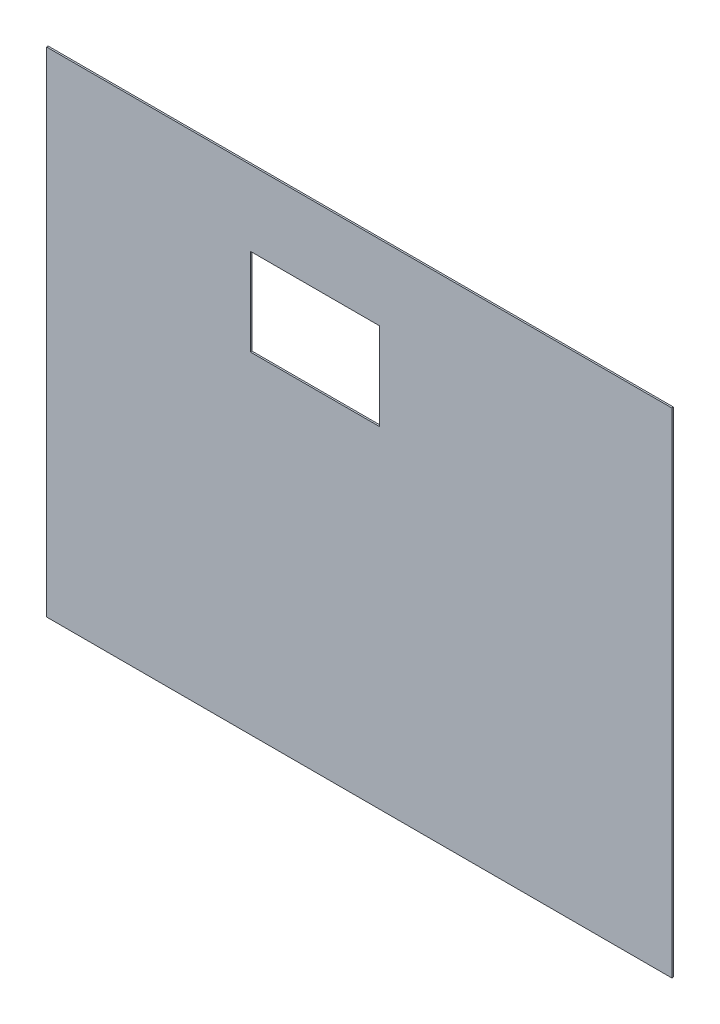
ISO-10303-21;
HEADER;
FILE_DESCRIPTION(('STEP AP214'),'2;1');
FILE_NAME('part.step','',(''),(''),'','','');
FILE_SCHEMA(('AUTOMOTIVE_DESIGN { 1 0 10303 214 1 1 1 1 }'));
ENDSEC;
DATA;
#1=APPLICATION_CONTEXT('core data for automotive mechanical design processes');
#2=APPLICATION_PROTOCOL_DEFINITION('international standard','automotive_design',2000,#1);
#3=PRODUCT_CONTEXT('',#1,'mechanical');
#4=PRODUCT('Part','Part','',(#3));
#5=PRODUCT_RELATED_PRODUCT_CATEGORY('part','',(#4));
#6=PRODUCT_DEFINITION_FORMATION('','',#4);
#7=PRODUCT_DEFINITION_CONTEXT('part definition',#1,'design');
#8=PRODUCT_DEFINITION('design','',#6,#7);
#9=PRODUCT_DEFINITION_SHAPE('','',#8);
#10=(LENGTH_UNIT() NAMED_UNIT(*) SI_UNIT(.MILLI.,.METRE.));
#11=(NAMED_UNIT(*) PLANE_ANGLE_UNIT() SI_UNIT($,.RADIAN.));
#12=(NAMED_UNIT(*) SI_UNIT($,.STERADIAN.) SOLID_ANGLE_UNIT());
#13=UNCERTAINTY_MEASURE_WITH_UNIT(LENGTH_MEASURE(1.E-05),#10,'distance_accuracy_value','');
#14=(GEOMETRIC_REPRESENTATION_CONTEXT(3) GLOBAL_UNCERTAINTY_ASSIGNED_CONTEXT((#13)) GLOBAL_UNIT_ASSIGNED_CONTEXT((#10,
#11,#12)) REPRESENTATION_CONTEXT('',''));
#15=CARTESIAN_POINT('',(0.,0.,0.));
#16=DIRECTION('',(0.,0.,1.));
#17=DIRECTION('',(1.,0.,0.));
#18=AXIS2_PLACEMENT_3D('',#15,#16,#17);
#19=CARTESIAN_POINT('',(-190.,-150.,1.));
#20=DIRECTION('',(1.,0.,0.));
#21=DIRECTION('',(0.,0.,-1.));
#22=AXIS2_PLACEMENT_3D('',#19,#20,#21);
#23=PLANE('',#22);
#24=DIRECTION('',(0.,-1.,0.));
#25=VECTOR('',#24,1.);
#26=CARTESIAN_POINT('',(-190.,-150.,0.));
#27=LINE('',#26,#25);
#28=CARTESIAN_POINT('',(-190.,150.,0.));
#29=VERTEX_POINT('',#28);
#30=CARTESIAN_POINT('',(-190.,-150.,0.));
#31=VERTEX_POINT('',#30);
#32=EDGE_CURVE('E132',#29,#31,#27,.T.);
#33=ORIENTED_EDGE('',*,*,#32,.T.);
#34=DIRECTION('',(0.,0.,-1.));
#35=VECTOR('',#34,1.);
#36=CARTESIAN_POINT('',(-190.,-150.,1.));
#37=LINE('',#36,#35);
#38=CARTESIAN_POINT('',(-190.,-150.,1.));
#39=VERTEX_POINT('',#38);
#40=EDGE_CURVE('E11',#39,#31,#37,.T.);
#41=ORIENTED_EDGE('',*,*,#40,.F.);
#42=DIRECTION('',(0.,-1.,0.));
#43=VECTOR('',#42,1.);
#44=CARTESIAN_POINT('',(-190.,-150.,1.));
#45=LINE('',#44,#43);
#46=CARTESIAN_POINT('',(-190.,150.,1.));
#47=VERTEX_POINT('',#46);
#48=EDGE_CURVE('E136',#47,#39,#45,.T.);
#49=ORIENTED_EDGE('',*,*,#48,.F.);
#50=DIRECTION('',(0.,0.,-1.));
#51=VECTOR('',#50,1.);
#52=CARTESIAN_POINT('',(-190.,150.,1.));
#53=LINE('',#52,#51);
#54=EDGE_CURVE('E146',#47,#29,#53,.T.);
#55=ORIENTED_EDGE('',*,*,#54,.T.);
#56=EDGE_LOOP('',(#33,#41,#49,#55));
#57=FACE_BOUND('',#56,.T.);
#58=ADVANCED_FACE('F35',(#57),#23,.F.);
#59=CARTESIAN_POINT('',(190.,-150.,1.));
#60=DIRECTION('',(0.,1.,0.));
#61=DIRECTION('',(-1.,0.,0.));
#62=AXIS2_PLACEMENT_3D('',#59,#60,#61);
#63=PLANE('',#62);
#64=DIRECTION('',(1.,0.,0.));
#65=VECTOR('',#64,1.);
#66=CARTESIAN_POINT('',(190.,-150.,0.));
#67=LINE('',#66,#65);
#68=CARTESIAN_POINT('',(190.,-150.,0.));
#69=VERTEX_POINT('',#68);
#70=EDGE_CURVE('E149',#31,#69,#67,.T.);
#71=ORIENTED_EDGE('',*,*,#70,.T.);
#72=DIRECTION('',(0.,0.,-1.));
#73=VECTOR('',#72,1.);
#74=CARTESIAN_POINT('',(190.,-150.,1.));
#75=LINE('',#74,#73);
#76=CARTESIAN_POINT('',(190.,-150.,1.));
#77=VERTEX_POINT('',#76);
#78=EDGE_CURVE('E42',#77,#69,#75,.T.);
#79=ORIENTED_EDGE('',*,*,#78,.F.);
#80=DIRECTION('',(1.,0.,0.));
#81=VECTOR('',#80,1.);
#82=CARTESIAN_POINT('',(190.,-150.,1.));
#83=LINE('',#82,#81);
#84=EDGE_CURVE('E139',#39,#77,#83,.T.);
#85=ORIENTED_EDGE('',*,*,#84,.F.);
#86=ORIENTED_EDGE('',*,*,#40,.T.);
#87=EDGE_LOOP('',(#71,#79,#85,#86));
#88=FACE_BOUND('',#87,.T.);
#89=ADVANCED_FACE('F177',(#88),#63,.F.);
#90=CARTESIAN_POINT('',(190.,-150.,1.));
#91=DIRECTION('',(-1.,0.,0.));
#92=DIRECTION('',(0.,0.,1.));
#93=AXIS2_PLACEMENT_3D('',#90,#91,#92);
#94=PLANE('',#93);
#95=DIRECTION('',(0.,1.,0.));
#96=VECTOR('',#95,1.);
#97=CARTESIAN_POINT('',(190.,-150.,0.));
#98=LINE('',#97,#96);
#99=CARTESIAN_POINT('',(190.,150.,0.));
#100=VERTEX_POINT('',#99);
#101=EDGE_CURVE('E151',#69,#100,#98,.T.);
#102=ORIENTED_EDGE('',*,*,#101,.T.);
#103=DIRECTION('',(0.,0.,-1.));
#104=VECTOR('',#103,1.);
#105=CARTESIAN_POINT('',(190.,150.,1.));
#106=LINE('',#105,#104);
#107=CARTESIAN_POINT('',(190.,150.,1.));
#108=VERTEX_POINT('',#107);
#109=EDGE_CURVE('E156',#108,#100,#106,.T.);
#110=ORIENTED_EDGE('',*,*,#109,.F.);
#111=DIRECTION('',(0.,1.,0.));
#112=VECTOR('',#111,1.);
#113=CARTESIAN_POINT('',(190.,-150.,1.));
#114=LINE('',#113,#112);
#115=EDGE_CURVE('E142',#77,#108,#114,.T.);
#116=ORIENTED_EDGE('',*,*,#115,.F.);
#117=ORIENTED_EDGE('',*,*,#78,.T.);
#118=EDGE_LOOP('',(#102,#110,#116,#117));
#119=FACE_BOUND('',#118,.T.);
#120=ADVANCED_FACE('F163',(#119),#94,.F.);
#121=CARTESIAN_POINT('',(190.,150.,1.));
#122=DIRECTION('',(0.,-1.,0.));
#123=DIRECTION('',(1.,0.,0.));
#124=AXIS2_PLACEMENT_3D('',#121,#122,#123);
#125=PLANE('',#124);
#126=DIRECTION('',(-1.,0.,0.));
#127=VECTOR('',#126,1.);
#128=CARTESIAN_POINT('',(190.,150.,0.));
#129=LINE('',#128,#127);
#130=EDGE_CURVE('E140',#100,#29,#129,.T.);
#131=ORIENTED_EDGE('',*,*,#130,.T.);
#132=ORIENTED_EDGE('',*,*,#54,.F.);
#133=DIRECTION('',(-1.,0.,0.));
#134=VECTOR('',#133,1.);
#135=CARTESIAN_POINT('',(190.,150.,1.));
#136=LINE('',#135,#134);
#137=EDGE_CURVE('E144',#108,#47,#136,.T.);
#138=ORIENTED_EDGE('',*,*,#137,.F.);
#139=ORIENTED_EDGE('',*,*,#109,.T.);
#140=EDGE_LOOP('',(#131,#132,#138,#139));
#141=FACE_BOUND('',#140,.T.);
#142=ADVANCED_FACE('F170',(#141),#125,.F.);
#143=CARTESIAN_POINT('',(0.,0.,1.));
#144=DIRECTION('',(0.,0.,1.));
#145=DIRECTION('',(1.,0.,0.));
#146=AXIS2_PLACEMENT_3D('',#143,#144,#145);
#147=PLANE('',#146);
#148=DIRECTION('',(0.,-1.,0.));
#149=VECTOR('',#148,1.);
#150=CARTESIAN_POINT('',(-66.1146415045895,104.408765544377,1.));
#151=LINE('',#150,#149);
#152=CARTESIAN_POINT('',(-66.1146415045895,104.408765544377,1.));
#153=VERTEX_POINT('',#152);
#154=CARTESIAN_POINT('',(-66.1146415045895,51.3861322585176,1.));
#155=VERTEX_POINT('',#154);
#156=EDGE_CURVE('E49',#153,#155,#151,.T.);
#157=ORIENTED_EDGE('',*,*,#156,.F.);
#158=DIRECTION('',(-1.,0.,0.));
#159=VECTOR('',#158,1.);
#160=CARTESIAN_POINT('',(-66.1146415045895,104.408765544377,1.));
#161=LINE('',#160,#159);
#162=CARTESIAN_POINT('',(12.4374078077941,104.408765544377,1.));
#163=VERTEX_POINT('',#162);
#164=EDGE_CURVE('E117',#163,#153,#161,.T.);
#165=ORIENTED_EDGE('',*,*,#164,.F.);
#166=DIRECTION('',(0.,1.,0.));
#167=VECTOR('',#166,1.);
#168=CARTESIAN_POINT('',(12.4374078077941,104.408765544377,1.));
#169=LINE('',#168,#167);
#170=CARTESIAN_POINT('',(12.4374078077941,51.3861322585176,1.));
#171=VERTEX_POINT('',#170);
#172=EDGE_CURVE('E120',#171,#163,#169,.T.);
#173=ORIENTED_EDGE('',*,*,#172,.F.);
#174=DIRECTION('',(1.,0.,0.));
#175=VECTOR('',#174,1.);
#176=CARTESIAN_POINT('',(-66.1146415045895,51.3861322585176,1.));
#177=LINE('',#176,#175);
#178=EDGE_CURVE('E126',#155,#171,#177,.T.);
#179=ORIENTED_EDGE('',*,*,#178,.F.);
#180=EDGE_LOOP('',(#157,#165,#173,#179));
#181=FACE_BOUND('',#180,.T.);
#182=ORIENTED_EDGE('',*,*,#48,.T.);
#183=ORIENTED_EDGE('',*,*,#84,.T.);
#184=ORIENTED_EDGE('',*,*,#115,.T.);
#185=ORIENTED_EDGE('',*,*,#137,.T.);
#186=EDGE_LOOP('',(#182,#183,#184,#185));
#187=FACE_BOUND('',#186,.T.);
#188=ADVANCED_FACE('F176',(#181,#187),#147,.T.);
#189=CARTESIAN_POINT('',(0.,0.,0.));
#190=DIRECTION('',(0.,0.,1.));
#191=DIRECTION('',(1.,0.,0.));
#192=AXIS2_PLACEMENT_3D('',#189,#190,#191);
#193=PLANE('',#192);
#194=DIRECTION('',(-1.,0.,0.));
#195=VECTOR('',#194,1.);
#196=CARTESIAN_POINT('',(-66.1146415045895,104.408765544377,0.));
#197=LINE('',#196,#195);
#198=CARTESIAN_POINT('',(12.4374078077941,104.408765544377,0.));
#199=VERTEX_POINT('',#198);
#200=CARTESIAN_POINT('',(-66.1146415045895,104.408765544377,0.));
#201=VERTEX_POINT('',#200);
#202=EDGE_CURVE('E107',#199,#201,#197,.T.);
#203=ORIENTED_EDGE('',*,*,#202,.T.);
#204=DIRECTION('',(0.,-1.,0.));
#205=VECTOR('',#204,1.);
#206=CARTESIAN_POINT('',(-66.1146415045895,104.408765544377,0.));
#207=LINE('',#206,#205);
#208=CARTESIAN_POINT('',(-66.1146415045895,51.3861322585176,0.));
#209=VERTEX_POINT('',#208);
#210=EDGE_CURVE('E101',#201,#209,#207,.T.);
#211=ORIENTED_EDGE('',*,*,#210,.T.);
#212=DIRECTION('',(1.,0.,0.));
#213=VECTOR('',#212,1.);
#214=CARTESIAN_POINT('',(-66.1146415045895,51.3861322585176,0.));
#215=LINE('',#214,#213);
#216=CARTESIAN_POINT('',(12.4374078077941,51.3861322585176,0.));
#217=VERTEX_POINT('',#216);
#218=EDGE_CURVE('E110',#209,#217,#215,.T.);
#219=ORIENTED_EDGE('',*,*,#218,.T.);
#220=DIRECTION('',(0.,1.,0.));
#221=VECTOR('',#220,1.);
#222=CARTESIAN_POINT('',(12.4374078077941,104.408765544377,0.));
#223=LINE('',#222,#221);
#224=EDGE_CURVE('E57',#217,#199,#223,.T.);
#225=ORIENTED_EDGE('',*,*,#224,.T.);
#226=EDGE_LOOP('',(#203,#211,#219,#225));
#227=FACE_BOUND('',#226,.T.);
#228=ORIENTED_EDGE('',*,*,#32,.F.);
#229=ORIENTED_EDGE('',*,*,#130,.F.);
#230=ORIENTED_EDGE('',*,*,#101,.F.);
#231=ORIENTED_EDGE('',*,*,#70,.F.);
#232=EDGE_LOOP('',(#228,#229,#230,#231));
#233=FACE_BOUND('',#232,.T.);
#234=ADVANCED_FACE('F114',(#227,#233),#193,.F.);
#235=CARTESIAN_POINT('',(-66.1146415045895,104.408765544377,0.));
#236=DIRECTION('',(-1.,0.,0.));
#237=DIRECTION('',(0.,0.,1.));
#238=AXIS2_PLACEMENT_3D('',#235,#236,#237);
#239=PLANE('',#238);
#240=ORIENTED_EDGE('',*,*,#156,.T.);
#241=DIRECTION('',(0.,0.,1.));
#242=VECTOR('',#241,1.);
#243=CARTESIAN_POINT('',(-66.1146415045895,51.3861322585176,0.));
#244=LINE('',#243,#242);
#245=EDGE_CURVE('E97',#209,#155,#244,.T.);
#246=ORIENTED_EDGE('',*,*,#245,.F.);
#247=ORIENTED_EDGE('',*,*,#210,.F.);
#248=DIRECTION('',(0.,0.,1.));
#249=VECTOR('',#248,1.);
#250=CARTESIAN_POINT('',(-66.1146415045895,104.408765544377,0.));
#251=LINE('',#250,#249);
#252=EDGE_CURVE('E130',#201,#153,#251,.T.);
#253=ORIENTED_EDGE('',*,*,#252,.T.);
#254=EDGE_LOOP('',(#240,#246,#247,#253));
#255=FACE_BOUND('',#254,.T.);
#256=ADVANCED_FACE('F99',(#255),#239,.F.);
#257=CARTESIAN_POINT('',(-66.1146415045895,104.408765544377,0.));
#258=DIRECTION('',(0.,1.,0.));
#259=DIRECTION('',(0.,0.,1.));
#260=AXIS2_PLACEMENT_3D('',#257,#258,#259);
#261=PLANE('',#260);
#262=ORIENTED_EDGE('',*,*,#164,.T.);
#263=ORIENTED_EDGE('',*,*,#252,.F.);
#264=ORIENTED_EDGE('',*,*,#202,.F.);
#265=DIRECTION('',(0.,0.,1.));
#266=VECTOR('',#265,1.);
#267=CARTESIAN_POINT('',(12.4374078077941,104.408765544377,0.));
#268=LINE('',#267,#266);
#269=EDGE_CURVE('E133',#199,#163,#268,.T.);
#270=ORIENTED_EDGE('',*,*,#269,.T.);
#271=EDGE_LOOP('',(#262,#263,#264,#270));
#272=FACE_BOUND('',#271,.T.);
#273=ADVANCED_FACE('F194',(#272),#261,.F.);
#274=CARTESIAN_POINT('',(12.4374078077941,104.408765544377,0.));
#275=DIRECTION('',(1.,0.,0.));
#276=DIRECTION('',(0.,0.,-1.));
#277=AXIS2_PLACEMENT_3D('',#274,#275,#276);
#278=PLANE('',#277);
#279=ORIENTED_EDGE('',*,*,#172,.T.);
#280=ORIENTED_EDGE('',*,*,#269,.F.);
#281=ORIENTED_EDGE('',*,*,#224,.F.);
#282=DIRECTION('',(0.,0.,1.));
#283=VECTOR('',#282,1.);
#284=CARTESIAN_POINT('',(12.4374078077941,51.3861322585176,0.));
#285=LINE('',#284,#283);
#286=EDGE_CURVE('E106',#217,#171,#285,.T.);
#287=ORIENTED_EDGE('',*,*,#286,.T.);
#288=EDGE_LOOP('',(#279,#280,#281,#287));
#289=FACE_BOUND('',#288,.T.);
#290=ADVANCED_FACE('F197',(#289),#278,.F.);
#291=CARTESIAN_POINT('',(-66.1146415045895,51.3861322585176,0.));
#292=DIRECTION('',(0.,-1.,0.));
#293=DIRECTION('',(0.,0.,-1.));
#294=AXIS2_PLACEMENT_3D('',#291,#292,#293);
#295=PLANE('',#294);
#296=ORIENTED_EDGE('',*,*,#178,.T.);
#297=ORIENTED_EDGE('',*,*,#286,.F.);
#298=ORIENTED_EDGE('',*,*,#218,.F.);
#299=ORIENTED_EDGE('',*,*,#245,.T.);
#300=EDGE_LOOP('',(#296,#297,#298,#299));
#301=FACE_BOUND('',#300,.T.);
#302=ADVANCED_FACE('F111',(#301),#295,.F.);
#303=CLOSED_SHELL('',(#58,#89,#120,#142,#188,#234,#256,#273,#290,#302));
#304=MANIFOLD_SOLID_BREP('B2',#303);
#305=ADVANCED_BREP_SHAPE_REPRESENTATION('',(#18,#304),#14);
#306=SHAPE_DEFINITION_REPRESENTATION(#9,#305);
ENDSEC;
END-ISO-10303-21;
